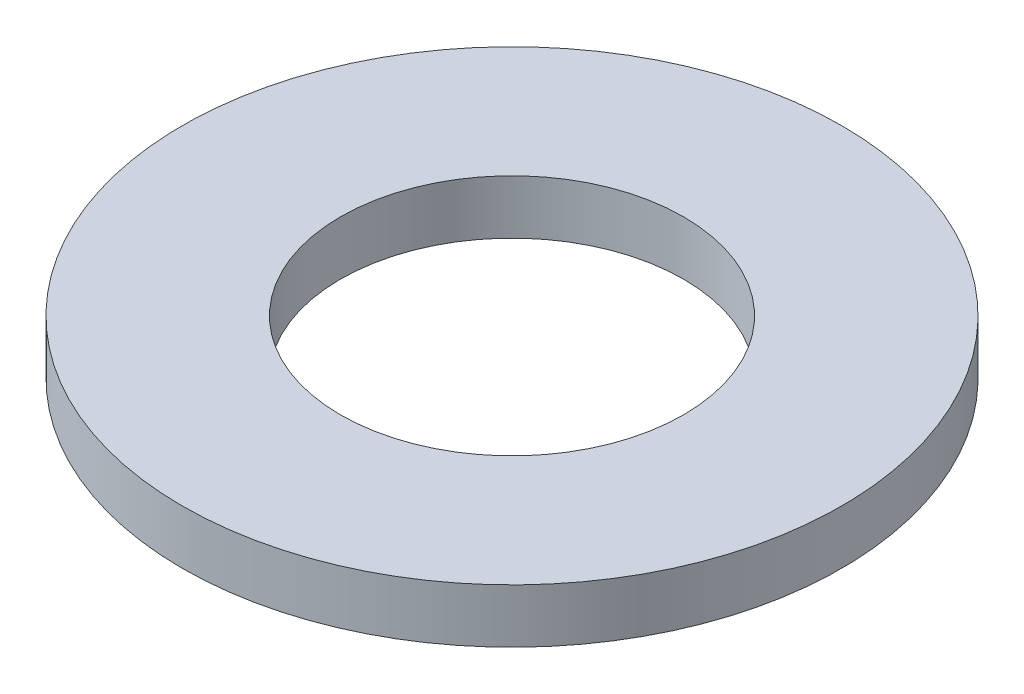
ISO-10303-21;
HEADER;
FILE_DESCRIPTION(('STEP AP214'),'2;1');
FILE_NAME('part.step','',(''),(''),'','','');
FILE_SCHEMA(('AUTOMOTIVE_DESIGN { 1 0 10303 214 1 1 1 1 }'));
ENDSEC;
DATA;
#1=APPLICATION_CONTEXT('core data for automotive mechanical design processes');
#2=APPLICATION_PROTOCOL_DEFINITION('international standard','automotive_design',2000,#1);
#3=PRODUCT_CONTEXT('',#1,'mechanical');
#4=PRODUCT('Part','Part','',(#3));
#5=PRODUCT_RELATED_PRODUCT_CATEGORY('part','',(#4));
#6=PRODUCT_DEFINITION_FORMATION('','',#4);
#7=PRODUCT_DEFINITION_CONTEXT('part definition',#1,'design');
#8=PRODUCT_DEFINITION('design','',#6,#7);
#9=PRODUCT_DEFINITION_SHAPE('','',#8);
#10=(LENGTH_UNIT() NAMED_UNIT(*) SI_UNIT(.MILLI.,.METRE.));
#11=(NAMED_UNIT(*) PLANE_ANGLE_UNIT() SI_UNIT($,.RADIAN.));
#12=(NAMED_UNIT(*) SI_UNIT($,.STERADIAN.) SOLID_ANGLE_UNIT());
#13=UNCERTAINTY_MEASURE_WITH_UNIT(LENGTH_MEASURE(1.E-05),#10,'distance_accuracy_value','');
#14=(GEOMETRIC_REPRESENTATION_CONTEXT(3) GLOBAL_UNCERTAINTY_ASSIGNED_CONTEXT((#13)) GLOBAL_UNIT_ASSIGNED_CONTEXT((#10,
#11,#12)) REPRESENTATION_CONTEXT('',''));
#15=CARTESIAN_POINT('',(0.,0.,0.));
#16=DIRECTION('',(0.,0.,1.));
#17=DIRECTION('',(1.,0.,0.));
#18=AXIS2_PLACEMENT_3D('',#15,#16,#17);
#19=CARTESIAN_POINT('',(0.,2.,0.));
#20=DIRECTION('',(0.,1.,0.));
#21=DIRECTION('',(0.,0.,1.));
#22=AXIS2_PLACEMENT_3D('',#19,#20,#21);
#23=PLANE('',#22);
#24=CARTESIAN_POINT('',(0.,2.,0.));
#25=DIRECTION('',(0.,1.,0.));
#26=DIRECTION('',(0.,0.,1.));
#27=AXIS2_PLACEMENT_3D('',#24,#25,#26);
#28=CIRCLE('',#27,12.2);
#29=CARTESIAN_POINT('',(0.,2.,12.2));
#30=VERTEX_POINT('',#29);
#31=EDGE_CURVE('E10',#30,#30,#28,.T.);
#32=ORIENTED_EDGE('',*,*,#31,.T.);
#33=EDGE_LOOP('',(#32));
#34=FACE_BOUND('',#33,.T.);
#35=CARTESIAN_POINT('',(0.,2.,0.));
#36=DIRECTION('',(0.,1.,0.));
#37=DIRECTION('',(0.,0.,1.));
#38=AXIS2_PLACEMENT_3D('',#35,#36,#37);
#39=CIRCLE('',#38,6.35);
#40=CARTESIAN_POINT('',(0.,2.,6.35));
#41=VERTEX_POINT('',#40);
#42=EDGE_CURVE('E42',#41,#41,#39,.T.);
#43=ORIENTED_EDGE('',*,*,#42,.F.);
#44=EDGE_LOOP('',(#43));
#45=FACE_BOUND('',#44,.T.);
#46=ADVANCED_FACE('F31',(#34,#45),#23,.T.);
#47=CARTESIAN_POINT('',(0.,0.,0.));
#48=DIRECTION('',(0.,1.,0.));
#49=DIRECTION('',(0.,0.,1.));
#50=AXIS2_PLACEMENT_3D('',#47,#48,#49);
#51=PLANE('',#50);
#52=CARTESIAN_POINT('',(0.,0.,0.));
#53=DIRECTION('',(0.,1.,0.));
#54=DIRECTION('',(0.,0.,1.));
#55=AXIS2_PLACEMENT_3D('',#52,#53,#54);
#56=CIRCLE('',#55,12.2);
#57=CARTESIAN_POINT('',(0.,0.,12.2));
#58=VERTEX_POINT('',#57);
#59=EDGE_CURVE('E35',#58,#58,#56,.T.);
#60=ORIENTED_EDGE('',*,*,#59,.F.);
#61=EDGE_LOOP('',(#60));
#62=FACE_BOUND('',#61,.T.);
#63=CARTESIAN_POINT('',(0.,0.,0.));
#64=DIRECTION('',(0.,1.,0.));
#65=DIRECTION('',(0.,0.,1.));
#66=AXIS2_PLACEMENT_3D('',#63,#64,#65);
#67=CIRCLE('',#66,6.35);
#68=CARTESIAN_POINT('',(0.,0.,6.35));
#69=VERTEX_POINT('',#68);
#70=EDGE_CURVE('E44',#69,#69,#67,.T.);
#71=ORIENTED_EDGE('',*,*,#70,.T.);
#72=EDGE_LOOP('',(#71));
#73=FACE_BOUND('',#72,.T.);
#74=ADVANCED_FACE('F54',(#62,#73),#51,.F.);
#75=CARTESIAN_POINT('',(0.,2.,0.));
#76=DIRECTION('',(0.,-1.,0.));
#77=DIRECTION('',(0.,0.,-1.));
#78=AXIS2_PLACEMENT_3D('',#75,#76,#77);
#79=CYLINDRICAL_SURFACE('',#78,12.2);
#80=ORIENTED_EDGE('',*,*,#31,.F.);
#81=EDGE_LOOP('',(#80));
#82=FACE_BOUND('',#81,.T.);
#83=ORIENTED_EDGE('',*,*,#59,.T.);
#84=EDGE_LOOP('',(#83));
#85=FACE_BOUND('',#84,.T.);
#86=ADVANCED_FACE('F33',(#82,#85),#79,.T.);
#87=CARTESIAN_POINT('',(0.,2.,0.));
#88=DIRECTION('',(0.,-1.,0.));
#89=DIRECTION('',(0.,0.,-1.));
#90=AXIS2_PLACEMENT_3D('',#87,#88,#89);
#91=CYLINDRICAL_SURFACE('',#90,6.35);
#92=ORIENTED_EDGE('',*,*,#42,.T.);
#93=EDGE_LOOP('',(#92));
#94=FACE_BOUND('',#93,.T.);
#95=ORIENTED_EDGE('',*,*,#70,.F.);
#96=EDGE_LOOP('',(#95));
#97=FACE_BOUND('',#96,.T.);
#98=ADVANCED_FACE('F50',(#94,#97),#91,.F.);
#99=CLOSED_SHELL('',(#46,#74,#86,#98));
#100=MANIFOLD_SOLID_BREP('B2',#99);
#101=ADVANCED_BREP_SHAPE_REPRESENTATION('',(#18,#100),#14);
#102=SHAPE_DEFINITION_REPRESENTATION(#9,#101);
ENDSEC;
END-ISO-10303-21;
